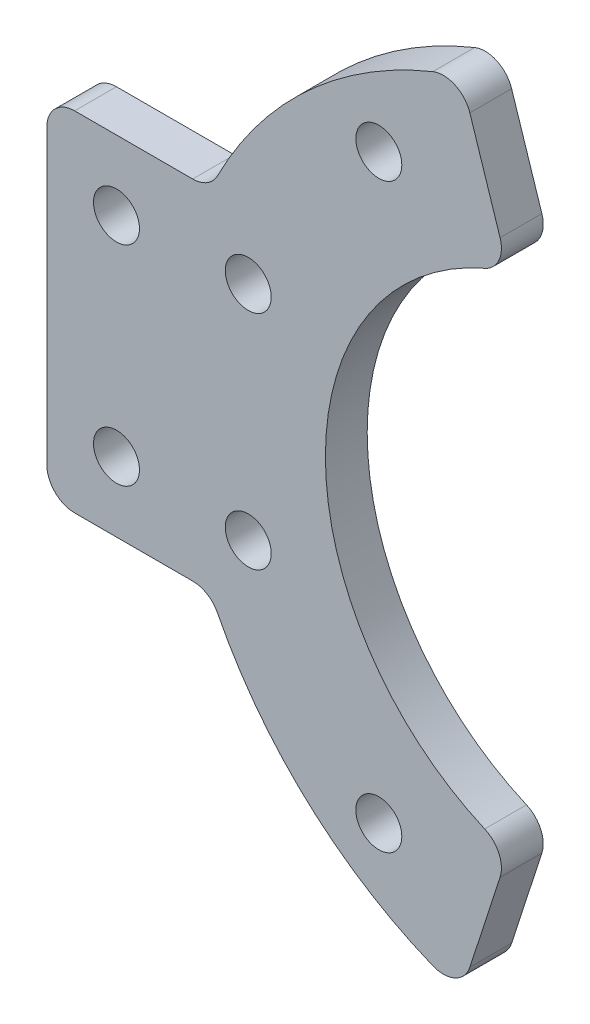
ISO-10303-21;
HEADER;
FILE_DESCRIPTION(('STEP AP214'),'2;1');
FILE_NAME('part.step','',(''),(''),'','','');
FILE_SCHEMA(('AUTOMOTIVE_DESIGN { 1 0 10303 214 1 1 1 1 }'));
ENDSEC;
DATA;
#1=APPLICATION_CONTEXT('core data for automotive mechanical design processes');
#2=APPLICATION_PROTOCOL_DEFINITION('international standard','automotive_design',2000,#1);
#3=PRODUCT_CONTEXT('',#1,'mechanical');
#4=PRODUCT('Part','Part','',(#3));
#5=PRODUCT_RELATED_PRODUCT_CATEGORY('part','',(#4));
#6=PRODUCT_DEFINITION_FORMATION('','',#4);
#7=PRODUCT_DEFINITION_CONTEXT('part definition',#1,'design');
#8=PRODUCT_DEFINITION('design','',#6,#7);
#9=PRODUCT_DEFINITION_SHAPE('','',#8);
#10=(LENGTH_UNIT() NAMED_UNIT(*) SI_UNIT(.MILLI.,.METRE.));
#11=(NAMED_UNIT(*) PLANE_ANGLE_UNIT() SI_UNIT($,.RADIAN.));
#12=(NAMED_UNIT(*) SI_UNIT($,.STERADIAN.) SOLID_ANGLE_UNIT());
#13=UNCERTAINTY_MEASURE_WITH_UNIT(LENGTH_MEASURE(1.E-05),#10,'distance_accuracy_value','');
#14=(GEOMETRIC_REPRESENTATION_CONTEXT(3) GLOBAL_UNCERTAINTY_ASSIGNED_CONTEXT((#13)) GLOBAL_UNIT_ASSIGNED_CONTEXT((#10,
#11,#12)) REPRESENTATION_CONTEXT('',''));
#15=CARTESIAN_POINT('',(0.,0.,0.));
#16=DIRECTION('',(0.,0.,1.));
#17=DIRECTION('',(1.,0.,0.));
#18=AXIS2_PLACEMENT_3D('',#15,#16,#17);
#19=CARTESIAN_POINT('',(-16.7239453700376,38.5267394319841,0.));
#20=DIRECTION('',(0.,0.,-1.));
#21=DIRECTION('',(-1.,0.,0.));
#22=AXIS2_PLACEMENT_3D('',#19,#20,#21);
#23=PLANE('',#22);
#24=CARTESIAN_POINT('',(-49.0745162408299,15.9452769097473,0.));
#25=DIRECTION('',(0.,0.,1.));
#26=DIRECTION('',(1.,0.,0.));
#27=AXIS2_PLACEMENT_3D('',#24,#25,#26);
#28=CIRCLE('',#27,3.3);
#29=CARTESIAN_POINT('',(-45.7745162408299,15.9452769097473,0.));
#30=VERTEX_POINT('',#29);
#31=EDGE_CURVE('E556',#30,#30,#28,.T.);
#32=ORIENTED_EDGE('',*,*,#31,.T.);
#33=EDGE_LOOP('',(#32));
#34=FACE_BOUND('',#33,.T.);
#35=CARTESIAN_POINT('',(-30.3297190182916,-41.7452769097473,0.));
#36=DIRECTION('',(0.,0.,1.));
#37=DIRECTION('',(1.,0.,0.));
#38=AXIS2_PLACEMENT_3D('',#35,#36,#37);
#39=CIRCLE('',#38,3.29999999999999);
#40=CARTESIAN_POINT('',(-27.0297190182916,-41.7452769097473,0.));
#41=VERTEX_POINT('',#40);
#42=EDGE_CURVE('E567',#41,#41,#39,.T.);
#43=ORIENTED_EDGE('',*,*,#42,.T.);
#44=EDGE_LOOP('',(#43));
#45=FACE_BOUND('',#44,.T.);
#46=CARTESIAN_POINT('',(-49.0745162408299,-15.9452769097473,0.));
#47=DIRECTION('',(0.,0.,1.));
#48=DIRECTION('',(1.,0.,0.));
#49=AXIS2_PLACEMENT_3D('',#46,#47,#48);
#50=CIRCLE('',#49,3.3);
#51=CARTESIAN_POINT('',(-45.7745162408299,-15.9452769097473,0.));
#52=VERTEX_POINT('',#51);
#53=EDGE_CURVE('E562',#52,#52,#50,.T.);
#54=ORIENTED_EDGE('',*,*,#53,.T.);
#55=EDGE_LOOP('',(#54));
#56=FACE_BOUND('',#55,.T.);
#57=CARTESIAN_POINT('',(-30.3297190182916,41.7452769097473,0.));
#58=DIRECTION('',(0.,0.,1.));
#59=DIRECTION('',(1.,0.,0.));
#60=AXIS2_PLACEMENT_3D('',#57,#58,#59);
#61=CIRCLE('',#60,3.30000000000001);
#62=CARTESIAN_POINT('',(-27.0297190182916,41.7452769097473,0.));
#63=VERTEX_POINT('',#62);
#64=EDGE_CURVE('E550',#63,#63,#61,.T.);
#65=ORIENTED_EDGE('',*,*,#64,.T.);
#66=EDGE_LOOP('',(#65));
#67=FACE_BOUND('',#66,.T.);
#68=CARTESIAN_POINT('',(0.,0.,0.));
#69=DIRECTION('',(0.,0.,1.));
#70=DIRECTION('',(-1.,0.,0.));
#71=AXIS2_PLACEMENT_3D('',#68,#69,#70);
#72=CIRCLE('',#71,60.);
#73=CARTESIAN_POINT('',(-53.4868193459847,-27.1875,0.));
#74=VERTEX_POINT('',#73);
#75=CARTESIAN_POINT('',(-22.5696171572181,-55.5932764044053,0.));
#76=VERTEX_POINT('',#75);
#77=EDGE_CURVE('E212',#74,#76,#72,.T.);
#78=ORIENTED_EDGE('',*,*,#77,.F.);
#79=CARTESIAN_POINT('',(0.,0.,0.));
#80=DIRECTION('',(0.,0.,-1.));
#81=DIRECTION('',(-1.,0.,0.));
#82=AXIS2_PLACEMENT_3D('',#79,#80,#81);
#83=CIRCLE('',#82,60.);
#84=CARTESIAN_POINT('',(-53.4868193459847,27.1875,0.));
#85=VERTEX_POINT('',#84);
#86=EDGE_CURVE('E11',#74,#85,#83,.T.);
#87=ORIENTED_EDGE('',*,*,#86,.T.);
#88=CARTESIAN_POINT('',(0.,0.,0.));
#89=DIRECTION('',(0.,0.,1.));
#90=DIRECTION('',(-1.,0.,0.));
#91=AXIS2_PLACEMENT_3D('',#88,#89,#90);
#92=CIRCLE('',#91,60.);
#93=CARTESIAN_POINT('',(-22.569617157218,55.5932764044053,0.));
#94=VERTEX_POINT('',#93);
#95=EDGE_CURVE('E194',#94,#85,#92,.T.);
#96=ORIENTED_EDGE('',*,*,#95,.F.);
#97=CARTESIAN_POINT('',(-21.0649760134035,51.887057977445,0.));
#98=DIRECTION('',(0.,0.,1.));
#99=DIRECTION('',(1.,0.,0.));
#100=AXIS2_PLACEMENT_3D('',#97,#98,#99);
#101=CIRCLE('',#100,4.);
#102=CARTESIAN_POINT('',(-17.2607499482229,53.1231259549447,0.));
#103=VERTEX_POINT('',#102);
#104=EDGE_CURVE('E192',#103,#94,#101,.T.);
#105=ORIENTED_EDGE('',*,*,#104,.F.);
#106=DIRECTION('',(-0.309016994374945,0.951056516295154,0.));
#107=VECTOR('',#106,1.);
#108=CARTESIAN_POINT('',(-17.2607499482229,53.1231259549447,0.));
#109=LINE('',#108,#107);
#110=CARTESIAN_POINT('',(-12.9197193048569,39.7628074094839,0.));
#111=VERTEX_POINT('',#110);
#112=EDGE_CURVE('E189',#111,#103,#109,.T.);
#113=ORIENTED_EDGE('',*,*,#112,.F.);
#114=CARTESIAN_POINT('',(-16.7239453700376,38.5267394319841,0.));
#115=DIRECTION('',(0.,0.,1.));
#116=DIRECTION('',(-1.,0.,0.));
#117=AXIS2_PLACEMENT_3D('',#114,#115,#116);
#118=CIRCLE('',#117,4.);
#119=CARTESIAN_POINT('',(-15.1311886681292,34.8575261527475,0.));
#120=VERTEX_POINT('',#119);
#121=EDGE_CURVE('E186',#120,#111,#118,.T.);
#122=ORIENTED_EDGE('',*,*,#121,.F.);
#123=CARTESIAN_POINT('',(0.,0.,0.));
#124=DIRECTION('',(0.,0.,-1.));
#125=DIRECTION('',(-1.,0.,0.));
#126=AXIS2_PLACEMENT_3D('',#123,#124,#125);
#127=CIRCLE('',#126,38.);
#128=CARTESIAN_POINT('',(-15.1311886681292,-34.8575261527475,0.));
#129=VERTEX_POINT('',#128);
#130=EDGE_CURVE('E115',#129,#120,#127,.T.);
#131=ORIENTED_EDGE('',*,*,#130,.F.);
#132=CARTESIAN_POINT('',(-16.7239453700376,-38.5267394319841,0.));
#133=DIRECTION('',(0.,0.,1.));
#134=DIRECTION('',(1.,0.,0.));
#135=AXIS2_PLACEMENT_3D('',#132,#133,#134);
#136=CIRCLE('',#135,4.);
#137=CARTESIAN_POINT('',(-12.9197193048569,-39.7628074094839,0.));
#138=VERTEX_POINT('',#137);
#139=EDGE_CURVE('E109',#138,#129,#136,.T.);
#140=ORIENTED_EDGE('',*,*,#139,.F.);
#141=DIRECTION('',(0.309016994374944,0.951056516295155,0.));
#142=VECTOR('',#141,1.);
#143=CARTESIAN_POINT('',(-12.9197193048569,-39.7628074094839,0.));
#144=LINE('',#143,#142);
#145=CARTESIAN_POINT('',(-17.2607499482229,-53.1231259549447,0.));
#146=VERTEX_POINT('',#145);
#147=EDGE_CURVE('E176',#146,#138,#144,.T.);
#148=ORIENTED_EDGE('',*,*,#147,.F.);
#149=CARTESIAN_POINT('',(-21.0649760134035,-51.887057977445,0.));
#150=DIRECTION('',(0.,0.,1.));
#151=DIRECTION('',(-1.,0.,0.));
#152=AXIS2_PLACEMENT_3D('',#149,#150,#151);
#153=CIRCLE('',#152,4.);
#154=EDGE_CURVE('E214',#76,#146,#153,.T.);
#155=ORIENTED_EDGE('',*,*,#154,.F.);
#156=EDGE_LOOP('',(#78,#87,#96,#105,#113,#122,#131,#140,#148,#155));
#157=FACE_BOUND('',#156,.T.);
#158=ADVANCED_FACE('F39',(#34,#45,#56,#67,#157),#23,.T.);
#159=CARTESIAN_POINT('',(-16.7239453700376,38.5267394319841,6.));
#160=DIRECTION('',(0.,0.,-1.));
#161=DIRECTION('',(-1.,0.,0.));
#162=AXIS2_PLACEMENT_3D('',#159,#160,#161);
#163=PLANE('',#162);
#164=CARTESIAN_POINT('',(-16.7239453700376,38.5267394319841,6.));
#165=DIRECTION('',(0.,0.,1.));
#166=DIRECTION('',(-1.,0.,0.));
#167=AXIS2_PLACEMENT_3D('',#164,#165,#166);
#168=CIRCLE('',#167,4.);
#169=CARTESIAN_POINT('',(-15.1311886681292,34.8575261527475,6.));
#170=VERTEX_POINT('',#169);
#171=CARTESIAN_POINT('',(-12.9197193048569,39.7628074094839,6.));
#172=VERTEX_POINT('',#171);
#173=EDGE_CURVE('E219',#170,#172,#168,.T.);
#174=ORIENTED_EDGE('',*,*,#173,.T.);
#175=DIRECTION('',(-0.309016994374945,0.951056516295154,0.));
#176=VECTOR('',#175,1.);
#177=CARTESIAN_POINT('',(-17.2607499482229,53.1231259549447,6.));
#178=LINE('',#177,#176);
#179=CARTESIAN_POINT('',(-17.2607499482229,53.1231259549447,6.));
#180=VERTEX_POINT('',#179);
#181=EDGE_CURVE('E124',#172,#180,#178,.T.);
#182=ORIENTED_EDGE('',*,*,#181,.T.);
#183=CARTESIAN_POINT('',(-21.0649760134035,51.887057977445,6.));
#184=DIRECTION('',(0.,0.,1.));
#185=DIRECTION('',(1.,0.,0.));
#186=AXIS2_PLACEMENT_3D('',#183,#184,#185);
#187=CIRCLE('',#186,4.);
#188=CARTESIAN_POINT('',(-22.569617157218,55.5932764044053,6.));
#189=VERTEX_POINT('',#188);
#190=EDGE_CURVE('E275',#180,#189,#187,.T.);
#191=ORIENTED_EDGE('',*,*,#190,.T.);
#192=CARTESIAN_POINT('',(0.,0.,6.));
#193=DIRECTION('',(0.,0.,1.));
#194=DIRECTION('',(-1.,0.,0.));
#195=AXIS2_PLACEMENT_3D('',#192,#193,#194);
#196=CIRCLE('',#195,60.);
#197=CARTESIAN_POINT('',(-53.4868193459847,27.1875,6.));
#198=VERTEX_POINT('',#197);
#199=EDGE_CURVE('E272',#189,#198,#196,.T.);
#200=ORIENTED_EDGE('',*,*,#199,.T.);
#201=CARTESIAN_POINT('',(-57.0526073023836,29.,6.));
#202=DIRECTION('',(0.,0.,-1.));
#203=DIRECTION('',(-1.,0.,0.));
#204=AXIS2_PLACEMENT_3D('',#201,#202,#203);
#205=CIRCLE('',#204,4.);
#206=CARTESIAN_POINT('',(-57.0526073023836,25.,6.));
#207=VERTEX_POINT('',#206);
#208=EDGE_CURVE('E274',#198,#207,#205,.T.);
#209=ORIENTED_EDGE('',*,*,#208,.T.);
#210=DIRECTION('',(-1.,0.,0.));
#211=VECTOR('',#210,1.);
#212=CARTESIAN_POINT('',(-57.0526073023836,25.,6.));
#213=LINE('',#212,#211);
#214=CARTESIAN_POINT('',(-74.,25.,6.));
#215=VERTEX_POINT('',#214);
#216=EDGE_CURVE('E277',#207,#215,#213,.T.);
#217=ORIENTED_EDGE('',*,*,#216,.T.);
#218=CARTESIAN_POINT('',(-74.,21.,6.));
#219=DIRECTION('',(0.,0.,1.));
#220=DIRECTION('',(1.,0.,0.));
#221=AXIS2_PLACEMENT_3D('',#218,#219,#220);
#222=CIRCLE('',#221,4.);
#223=CARTESIAN_POINT('',(-78.,21.,6.));
#224=VERTEX_POINT('',#223);
#225=EDGE_CURVE('E283',#215,#224,#222,.T.);
#226=ORIENTED_EDGE('',*,*,#225,.T.);
#227=DIRECTION('',(0.,-1.,0.));
#228=VECTOR('',#227,1.);
#229=CARTESIAN_POINT('',(-78.,21.,6.));
#230=LINE('',#229,#228);
#231=CARTESIAN_POINT('',(-78.,-21.,6.));
#232=VERTEX_POINT('',#231);
#233=EDGE_CURVE('E285',#224,#232,#230,.T.);
#234=ORIENTED_EDGE('',*,*,#233,.T.);
#235=CARTESIAN_POINT('',(-74.,-21.,6.));
#236=DIRECTION('',(0.,0.,1.));
#237=DIRECTION('',(1.,0.,0.));
#238=AXIS2_PLACEMENT_3D('',#235,#236,#237);
#239=CIRCLE('',#238,4.);
#240=CARTESIAN_POINT('',(-74.,-25.,6.));
#241=VERTEX_POINT('',#240);
#242=EDGE_CURVE('E287',#232,#241,#239,.T.);
#243=ORIENTED_EDGE('',*,*,#242,.T.);
#244=DIRECTION('',(1.,0.,0.));
#245=VECTOR('',#244,1.);
#246=CARTESIAN_POINT('',(-74.,-25.,6.));
#247=LINE('',#246,#245);
#248=CARTESIAN_POINT('',(-57.0526073023836,-25.,6.));
#249=VERTEX_POINT('',#248);
#250=EDGE_CURVE('E289',#241,#249,#247,.T.);
#251=ORIENTED_EDGE('',*,*,#250,.T.);
#252=CARTESIAN_POINT('',(-57.0526073023836,-29.,6.));
#253=DIRECTION('',(0.,0.,-1.));
#254=DIRECTION('',(1.,0.,0.));
#255=AXIS2_PLACEMENT_3D('',#252,#253,#254);
#256=CIRCLE('',#255,4.);
#257=CARTESIAN_POINT('',(-53.4868193459847,-27.1875,6.));
#258=VERTEX_POINT('',#257);
#259=EDGE_CURVE('E291',#249,#258,#256,.T.);
#260=ORIENTED_EDGE('',*,*,#259,.T.);
#261=CARTESIAN_POINT('',(0.,0.,6.));
#262=DIRECTION('',(0.,0.,1.));
#263=DIRECTION('',(-1.,0.,0.));
#264=AXIS2_PLACEMENT_3D('',#261,#262,#263);
#265=CIRCLE('',#264,60.);
#266=CARTESIAN_POINT('',(-22.5696171572181,-55.5932764044053,6.));
#267=VERTEX_POINT('',#266);
#268=EDGE_CURVE('E293',#258,#267,#265,.T.);
#269=ORIENTED_EDGE('',*,*,#268,.T.);
#270=CARTESIAN_POINT('',(-21.0649760134035,-51.887057977445,6.));
#271=DIRECTION('',(0.,0.,1.));
#272=DIRECTION('',(-1.,0.,0.));
#273=AXIS2_PLACEMENT_3D('',#270,#271,#272);
#274=CIRCLE('',#273,4.);
#275=CARTESIAN_POINT('',(-17.2607499482229,-53.1231259549447,6.));
#276=VERTEX_POINT('',#275);
#277=EDGE_CURVE('E168',#267,#276,#274,.T.);
#278=ORIENTED_EDGE('',*,*,#277,.T.);
#279=DIRECTION('',(0.309016994374944,0.951056516295155,0.));
#280=VECTOR('',#279,1.);
#281=CARTESIAN_POINT('',(-12.9197193048569,-39.7628074094839,6.));
#282=LINE('',#281,#280);
#283=CARTESIAN_POINT('',(-12.9197193048569,-39.7628074094839,6.));
#284=VERTEX_POINT('',#283);
#285=EDGE_CURVE('E161',#276,#284,#282,.T.);
#286=ORIENTED_EDGE('',*,*,#285,.T.);
#287=CARTESIAN_POINT('',(-16.7239453700376,-38.5267394319841,6.));
#288=DIRECTION('',(0.,0.,1.));
#289=DIRECTION('',(1.,0.,0.));
#290=AXIS2_PLACEMENT_3D('',#287,#288,#289);
#291=CIRCLE('',#290,4.);
#292=CARTESIAN_POINT('',(-15.1311886681292,-34.8575261527475,6.));
#293=VERTEX_POINT('',#292);
#294=EDGE_CURVE('E166',#284,#293,#291,.T.);
#295=ORIENTED_EDGE('',*,*,#294,.T.);
#296=CARTESIAN_POINT('',(0.,0.,6.));
#297=DIRECTION('',(0.,0.,-1.));
#298=DIRECTION('',(-1.,0.,0.));
#299=AXIS2_PLACEMENT_3D('',#296,#297,#298);
#300=CIRCLE('',#299,38.);
#301=EDGE_CURVE('E57',#293,#170,#300,.T.);
#302=ORIENTED_EDGE('',*,*,#301,.T.);
#303=EDGE_LOOP('',(#174,#182,#191,#200,#209,#217,#226,#234,#243,#251,#260,#269,#278,#286,#295,#302));
#304=FACE_BOUND('',#303,.T.);
#305=CARTESIAN_POINT('',(-68.,15.,6.));
#306=DIRECTION('',(0.,0.,1.));
#307=DIRECTION('',(1.,0.,0.));
#308=AXIS2_PLACEMENT_3D('',#305,#306,#307);
#309=CIRCLE('',#308,3.30000000000001);
#310=CARTESIAN_POINT('',(-64.7,15.,6.));
#311=VERTEX_POINT('',#310);
#312=EDGE_CURVE('E190',#311,#311,#309,.T.);
#313=ORIENTED_EDGE('',*,*,#312,.F.);
#314=EDGE_LOOP('',(#313));
#315=FACE_BOUND('',#314,.T.);
#316=CARTESIAN_POINT('',(-30.3297190182916,-41.7452769097473,6.));
#317=DIRECTION('',(0.,0.,1.));
#318=DIRECTION('',(1.,0.,0.));
#319=AXIS2_PLACEMENT_3D('',#316,#317,#318);
#320=CIRCLE('',#319,3.29999999999999);
#321=CARTESIAN_POINT('',(-27.0297190182916,-41.7452769097473,6.));
#322=VERTEX_POINT('',#321);
#323=EDGE_CURVE('E570',#322,#322,#320,.T.);
#324=ORIENTED_EDGE('',*,*,#323,.F.);
#325=EDGE_LOOP('',(#324));
#326=FACE_BOUND('',#325,.T.);
#327=CARTESIAN_POINT('',(-49.0745162408299,-15.9452769097473,6.));
#328=DIRECTION('',(0.,0.,1.));
#329=DIRECTION('',(1.,0.,0.));
#330=AXIS2_PLACEMENT_3D('',#327,#328,#329);
#331=CIRCLE('',#330,3.3);
#332=CARTESIAN_POINT('',(-45.7745162408299,-15.9452769097473,6.));
#333=VERTEX_POINT('',#332);
#334=EDGE_CURVE('E564',#333,#333,#331,.T.);
#335=ORIENTED_EDGE('',*,*,#334,.F.);
#336=EDGE_LOOP('',(#335));
#337=FACE_BOUND('',#336,.T.);
#338=CARTESIAN_POINT('',(-49.0745162408299,15.9452769097473,6.));
#339=DIRECTION('',(0.,0.,1.));
#340=DIRECTION('',(1.,0.,0.));
#341=AXIS2_PLACEMENT_3D('',#338,#339,#340);
#342=CIRCLE('',#341,3.3);
#343=CARTESIAN_POINT('',(-45.7745162408299,15.9452769097473,6.));
#344=VERTEX_POINT('',#343);
#345=EDGE_CURVE('E559',#344,#344,#342,.T.);
#346=ORIENTED_EDGE('',*,*,#345,.F.);
#347=EDGE_LOOP('',(#346));
#348=FACE_BOUND('',#347,.T.);
#349=CARTESIAN_POINT('',(-30.3297190182916,41.7452769097473,6.));
#350=DIRECTION('',(0.,0.,1.));
#351=DIRECTION('',(1.,0.,0.));
#352=AXIS2_PLACEMENT_3D('',#349,#350,#351);
#353=CIRCLE('',#352,3.30000000000001);
#354=CARTESIAN_POINT('',(-27.0297190182916,41.7452769097473,6.));
#355=VERTEX_POINT('',#354);
#356=EDGE_CURVE('E553',#355,#355,#353,.T.);
#357=ORIENTED_EDGE('',*,*,#356,.F.);
#358=EDGE_LOOP('',(#357));
#359=FACE_BOUND('',#358,.T.);
#360=CARTESIAN_POINT('',(-68.,-15.,6.));
#361=DIRECTION('',(0.,0.,1.));
#362=DIRECTION('',(1.,0.,0.));
#363=AXIS2_PLACEMENT_3D('',#360,#361,#362);
#364=CIRCLE('',#363,3.29999999999999);
#365=CARTESIAN_POINT('',(-64.7,-15.,6.));
#366=VERTEX_POINT('',#365);
#367=EDGE_CURVE('E544',#366,#366,#364,.T.);
#368=ORIENTED_EDGE('',*,*,#367,.F.);
#369=EDGE_LOOP('',(#368));
#370=FACE_BOUND('',#369,.T.);
#371=ADVANCED_FACE('F163',(#304,#315,#326,#337,#348,#359,#370),#163,.F.);
#372=ORIENTED_EDGE('',*,*,#86,.F.);
#373=CARTESIAN_POINT('',(-57.0526073023836,-29.,0.));
#374=DIRECTION('',(0.,0.,-1.));
#375=DIRECTION('',(1.,0.,0.));
#376=AXIS2_PLACEMENT_3D('',#373,#374,#375);
#377=CIRCLE('',#376,4.);
#378=CARTESIAN_POINT('',(-57.0526073023836,-25.,0.));
#379=VERTEX_POINT('',#378);
#380=EDGE_CURVE('E209',#379,#74,#377,.T.);
#381=ORIENTED_EDGE('',*,*,#380,.F.);
#382=DIRECTION('',(1.,0.,0.));
#383=VECTOR('',#382,1.);
#384=CARTESIAN_POINT('',(-74.,-25.,0.));
#385=LINE('',#384,#383);
#386=CARTESIAN_POINT('',(-74.,-25.,0.));
#387=VERTEX_POINT('',#386);
#388=EDGE_CURVE('E207',#387,#379,#385,.T.);
#389=ORIENTED_EDGE('',*,*,#388,.F.);
#390=CARTESIAN_POINT('',(-74.,-21.,0.));
#391=DIRECTION('',(0.,0.,1.));
#392=DIRECTION('',(1.,0.,0.));
#393=AXIS2_PLACEMENT_3D('',#390,#391,#392);
#394=CIRCLE('',#393,4.);
#395=CARTESIAN_POINT('',(-78.,-21.,0.));
#396=VERTEX_POINT('',#395);
#397=EDGE_CURVE('E205',#396,#387,#394,.T.);
#398=ORIENTED_EDGE('',*,*,#397,.F.);
#399=DIRECTION('',(0.,-1.,0.));
#400=VECTOR('',#399,1.);
#401=CARTESIAN_POINT('',(-78.,21.,0.));
#402=LINE('',#401,#400);
#403=CARTESIAN_POINT('',(-78.,21.,0.));
#404=VERTEX_POINT('',#403);
#405=EDGE_CURVE('E203',#404,#396,#402,.T.);
#406=ORIENTED_EDGE('',*,*,#405,.F.);
#407=CARTESIAN_POINT('',(-74.,21.,0.));
#408=DIRECTION('',(0.,0.,1.));
#409=DIRECTION('',(1.,0.,0.));
#410=AXIS2_PLACEMENT_3D('',#407,#408,#409);
#411=CIRCLE('',#410,4.);
#412=CARTESIAN_POINT('',(-74.,25.,0.));
#413=VERTEX_POINT('',#412);
#414=EDGE_CURVE('E201',#413,#404,#411,.T.);
#415=ORIENTED_EDGE('',*,*,#414,.F.);
#416=DIRECTION('',(-1.,0.,0.));
#417=VECTOR('',#416,1.);
#418=CARTESIAN_POINT('',(-57.0526073023836,25.,0.));
#419=LINE('',#418,#417);
#420=CARTESIAN_POINT('',(-57.0526073023836,25.,0.));
#421=VERTEX_POINT('',#420);
#422=EDGE_CURVE('E199',#421,#413,#419,.T.);
#423=ORIENTED_EDGE('',*,*,#422,.F.);
#424=CARTESIAN_POINT('',(-57.0526073023836,29.,0.));
#425=DIRECTION('',(0.,0.,-1.));
#426=DIRECTION('',(-1.,0.,0.));
#427=AXIS2_PLACEMENT_3D('',#424,#425,#426);
#428=CIRCLE('',#427,4.);
#429=EDGE_CURVE('E197',#85,#421,#428,.T.);
#430=ORIENTED_EDGE('',*,*,#429,.F.);
#431=EDGE_LOOP('',(#372,#381,#389,#398,#406,#415,#423,#430));
#432=FACE_BOUND('',#431,.T.);
#433=CARTESIAN_POINT('',(-68.,15.,0.));
#434=DIRECTION('',(0.,0.,1.));
#435=DIRECTION('',(1.,0.,0.));
#436=AXIS2_PLACEMENT_3D('',#433,#434,#435);
#437=CIRCLE('',#436,3.30000000000001);
#438=CARTESIAN_POINT('',(-64.7,15.,0.));
#439=VERTEX_POINT('',#438);
#440=EDGE_CURVE('E573',#439,#439,#437,.T.);
#441=ORIENTED_EDGE('',*,*,#440,.T.);
#442=EDGE_LOOP('',(#441));
#443=FACE_BOUND('',#442,.T.);
#444=CARTESIAN_POINT('',(-68.,-15.,0.));
#445=DIRECTION('',(0.,0.,1.));
#446=DIRECTION('',(1.,0.,0.));
#447=AXIS2_PLACEMENT_3D('',#444,#445,#446);
#448=CIRCLE('',#447,3.29999999999999);
#449=CARTESIAN_POINT('',(-64.7,-15.,0.));
#450=VERTEX_POINT('',#449);
#451=EDGE_CURVE('E547',#450,#450,#448,.T.);
#452=ORIENTED_EDGE('',*,*,#451,.T.);
#453=EDGE_LOOP('',(#452));
#454=FACE_BOUND('',#453,.T.);
#455=ADVANCED_FACE('F306',(#432,#443,#454),#23,.T.);
#456=CARTESIAN_POINT('',(-16.7239453700376,38.5267394319841,6.));
#457=DIRECTION('',(0.,0.,-1.));
#458=DIRECTION('',(-1.,0.,0.));
#459=AXIS2_PLACEMENT_3D('',#456,#457,#458);
#460=CYLINDRICAL_SURFACE('',#459,4.);
#461=ORIENTED_EDGE('',*,*,#121,.T.);
#462=DIRECTION('',(0.,0.,-1.));
#463=VECTOR('',#462,1.);
#464=CARTESIAN_POINT('',(-12.9197193048569,39.7628074094839,6.));
#465=LINE('',#464,#463);
#466=EDGE_CURVE('E49',#172,#111,#465,.T.);
#467=ORIENTED_EDGE('',*,*,#466,.F.);
#468=ORIENTED_EDGE('',*,*,#173,.F.);
#469=DIRECTION('',(0.,0.,-1.));
#470=VECTOR('',#469,1.);
#471=CARTESIAN_POINT('',(-15.1311886681292,34.8575261527475,6.));
#472=LINE('',#471,#470);
#473=EDGE_CURVE('E182',#170,#120,#472,.T.);
#474=ORIENTED_EDGE('',*,*,#473,.T.);
#475=EDGE_LOOP('',(#461,#467,#468,#474));
#476=FACE_BOUND('',#475,.T.);
#477=ADVANCED_FACE('F41',(#476),#460,.T.);
#478=CARTESIAN_POINT('',(-17.2607499482229,53.1231259549447,6.));
#479=DIRECTION('',(-0.951056516295154,-0.309016994374945,0.));
#480=DIRECTION('',(0.309016994374945,-0.951056516295154,0.));
#481=AXIS2_PLACEMENT_3D('',#478,#479,#480);
#482=PLANE('',#481);
#483=ORIENTED_EDGE('',*,*,#112,.T.);
#484=DIRECTION('',(0.,0.,-1.));
#485=VECTOR('',#484,1.);
#486=CARTESIAN_POINT('',(-17.2607499482229,53.1231259549447,6.));
#487=LINE('',#486,#485);
#488=EDGE_CURVE('E253',#180,#103,#487,.T.);
#489=ORIENTED_EDGE('',*,*,#488,.F.);
#490=ORIENTED_EDGE('',*,*,#181,.F.);
#491=ORIENTED_EDGE('',*,*,#466,.T.);
#492=EDGE_LOOP('',(#483,#489,#490,#491));
#493=FACE_BOUND('',#492,.T.);
#494=ADVANCED_FACE('F256',(#493),#482,.F.);
#495=CARTESIAN_POINT('',(-21.0649760134035,51.887057977445,6.));
#496=DIRECTION('',(0.,0.,-1.));
#497=DIRECTION('',(-1.,0.,0.));
#498=AXIS2_PLACEMENT_3D('',#495,#496,#497);
#499=CYLINDRICAL_SURFACE('',#498,4.);
#500=ORIENTED_EDGE('',*,*,#104,.T.);
#501=DIRECTION('',(0.,0.,-1.));
#502=VECTOR('',#501,1.);
#503=CARTESIAN_POINT('',(-22.569617157218,55.5932764044053,6.));
#504=LINE('',#503,#502);
#505=EDGE_CURVE('E250',#189,#94,#504,.T.);
#506=ORIENTED_EDGE('',*,*,#505,.F.);
#507=ORIENTED_EDGE('',*,*,#190,.F.);
#508=ORIENTED_EDGE('',*,*,#488,.T.);
#509=EDGE_LOOP('',(#500,#506,#507,#508));
#510=FACE_BOUND('',#509,.T.);
#511=ADVANCED_FACE('F266',(#510),#499,.T.);
#512=CARTESIAN_POINT('',(0.,0.,6.));
#513=DIRECTION('',(0.,0.,-1.));
#514=DIRECTION('',(-1.,0.,0.));
#515=AXIS2_PLACEMENT_3D('',#512,#513,#514);
#516=CYLINDRICAL_SURFACE('',#515,60.);
#517=ORIENTED_EDGE('',*,*,#95,.T.);
#518=DIRECTION('',(0.,0.,-1.));
#519=VECTOR('',#518,1.);
#520=CARTESIAN_POINT('',(-53.4868193459847,27.1875,6.));
#521=LINE('',#520,#519);
#522=EDGE_CURVE('E247',#198,#85,#521,.T.);
#523=ORIENTED_EDGE('',*,*,#522,.F.);
#524=ORIENTED_EDGE('',*,*,#199,.F.);
#525=ORIENTED_EDGE('',*,*,#505,.T.);
#526=EDGE_LOOP('',(#517,#523,#524,#525));
#527=FACE_BOUND('',#526,.T.);
#528=ADVANCED_FACE('F270',(#527),#516,.T.);
#529=CARTESIAN_POINT('',(-57.0526073023836,29.,6.));
#530=DIRECTION('',(0.,0.,-1.));
#531=DIRECTION('',(-1.,0.,0.));
#532=AXIS2_PLACEMENT_3D('',#529,#530,#531);
#533=CYLINDRICAL_SURFACE('',#532,4.);
#534=ORIENTED_EDGE('',*,*,#429,.T.);
#535=DIRECTION('',(0.,0.,-1.));
#536=VECTOR('',#535,1.);
#537=CARTESIAN_POINT('',(-57.0526073023836,25.,6.));
#538=LINE('',#537,#536);
#539=EDGE_CURVE('E244',#207,#421,#538,.T.);
#540=ORIENTED_EDGE('',*,*,#539,.F.);
#541=ORIENTED_EDGE('',*,*,#208,.F.);
#542=ORIENTED_EDGE('',*,*,#522,.T.);
#543=EDGE_LOOP('',(#534,#540,#541,#542));
#544=FACE_BOUND('',#543,.T.);
#545=ADVANCED_FACE('F337',(#544),#533,.F.);
#546=CARTESIAN_POINT('',(-57.0526073023836,25.,6.));
#547=DIRECTION('',(0.,-1.,0.));
#548=DIRECTION('',(1.,0.,0.));
#549=AXIS2_PLACEMENT_3D('',#546,#547,#548);
#550=PLANE('',#549);
#551=ORIENTED_EDGE('',*,*,#422,.T.);
#552=DIRECTION('',(0.,0.,-1.));
#553=VECTOR('',#552,1.);
#554=CARTESIAN_POINT('',(-74.,25.,6.));
#555=LINE('',#554,#553);
#556=EDGE_CURVE('E241',#215,#413,#555,.T.);
#557=ORIENTED_EDGE('',*,*,#556,.F.);
#558=ORIENTED_EDGE('',*,*,#216,.F.);
#559=ORIENTED_EDGE('',*,*,#539,.T.);
#560=EDGE_LOOP('',(#551,#557,#558,#559));
#561=FACE_BOUND('',#560,.T.);
#562=ADVANCED_FACE('F333',(#561),#550,.F.);
#563=CARTESIAN_POINT('',(-74.,21.,6.));
#564=DIRECTION('',(0.,0.,-1.));
#565=DIRECTION('',(-1.,0.,0.));
#566=AXIS2_PLACEMENT_3D('',#563,#564,#565);
#567=CYLINDRICAL_SURFACE('',#566,4.);
#568=ORIENTED_EDGE('',*,*,#414,.T.);
#569=DIRECTION('',(0.,0.,-1.));
#570=VECTOR('',#569,1.);
#571=CARTESIAN_POINT('',(-78.,21.,6.));
#572=LINE('',#571,#570);
#573=EDGE_CURVE('E238',#224,#404,#572,.T.);
#574=ORIENTED_EDGE('',*,*,#573,.F.);
#575=ORIENTED_EDGE('',*,*,#225,.F.);
#576=ORIENTED_EDGE('',*,*,#556,.T.);
#577=EDGE_LOOP('',(#568,#574,#575,#576));
#578=FACE_BOUND('',#577,.T.);
#579=ADVANCED_FACE('F330',(#578),#567,.T.);
#580=CARTESIAN_POINT('',(-78.,21.,6.));
#581=DIRECTION('',(1.,0.,0.));
#582=DIRECTION('',(0.,0.,-1.));
#583=AXIS2_PLACEMENT_3D('',#580,#581,#582);
#584=PLANE('',#583);
#585=ORIENTED_EDGE('',*,*,#405,.T.);
#586=DIRECTION('',(0.,0.,-1.));
#587=VECTOR('',#586,1.);
#588=CARTESIAN_POINT('',(-78.,-21.,6.));
#589=LINE('',#588,#587);
#590=EDGE_CURVE('E235',#232,#396,#589,.T.);
#591=ORIENTED_EDGE('',*,*,#590,.F.);
#592=ORIENTED_EDGE('',*,*,#233,.F.);
#593=ORIENTED_EDGE('',*,*,#573,.T.);
#594=EDGE_LOOP('',(#585,#591,#592,#593));
#595=FACE_BOUND('',#594,.T.);
#596=ADVANCED_FACE('F326',(#595),#584,.F.);
#597=CARTESIAN_POINT('',(-74.,-21.,6.));
#598=DIRECTION('',(0.,0.,-1.));
#599=DIRECTION('',(-1.,0.,0.));
#600=AXIS2_PLACEMENT_3D('',#597,#598,#599);
#601=CYLINDRICAL_SURFACE('',#600,4.);
#602=ORIENTED_EDGE('',*,*,#397,.T.);
#603=DIRECTION('',(0.,0.,-1.));
#604=VECTOR('',#603,1.);
#605=CARTESIAN_POINT('',(-74.,-25.,6.));
#606=LINE('',#605,#604);
#607=EDGE_CURVE('E232',#241,#387,#606,.T.);
#608=ORIENTED_EDGE('',*,*,#607,.F.);
#609=ORIENTED_EDGE('',*,*,#242,.F.);
#610=ORIENTED_EDGE('',*,*,#590,.T.);
#611=EDGE_LOOP('',(#602,#608,#609,#610));
#612=FACE_BOUND('',#611,.T.);
#613=ADVANCED_FACE('F321',(#612),#601,.T.);
#614=CARTESIAN_POINT('',(-74.,-25.,6.));
#615=DIRECTION('',(0.,1.,0.));
#616=DIRECTION('',(-1.,0.,0.));
#617=AXIS2_PLACEMENT_3D('',#614,#615,#616);
#618=PLANE('',#617);
#619=ORIENTED_EDGE('',*,*,#388,.T.);
#620=DIRECTION('',(0.,0.,-1.));
#621=VECTOR('',#620,1.);
#622=CARTESIAN_POINT('',(-57.0526073023836,-25.,6.));
#623=LINE('',#622,#621);
#624=EDGE_CURVE('E229',#249,#379,#623,.T.);
#625=ORIENTED_EDGE('',*,*,#624,.F.);
#626=ORIENTED_EDGE('',*,*,#250,.F.);
#627=ORIENTED_EDGE('',*,*,#607,.T.);
#628=EDGE_LOOP('',(#619,#625,#626,#627));
#629=FACE_BOUND('',#628,.T.);
#630=ADVANCED_FACE('F315',(#629),#618,.F.);
#631=CARTESIAN_POINT('',(-57.0526073023836,-29.,6.));
#632=DIRECTION('',(0.,0.,-1.));
#633=DIRECTION('',(-1.,0.,0.));
#634=AXIS2_PLACEMENT_3D('',#631,#632,#633);
#635=CYLINDRICAL_SURFACE('',#634,4.);
#636=ORIENTED_EDGE('',*,*,#380,.T.);
#637=DIRECTION('',(0.,0.,-1.));
#638=VECTOR('',#637,1.);
#639=CARTESIAN_POINT('',(-53.4868193459847,-27.1875,6.));
#640=LINE('',#639,#638);
#641=EDGE_CURVE('E226',#258,#74,#640,.T.);
#642=ORIENTED_EDGE('',*,*,#641,.F.);
#643=ORIENTED_EDGE('',*,*,#259,.F.);
#644=ORIENTED_EDGE('',*,*,#624,.T.);
#645=EDGE_LOOP('',(#636,#642,#643,#644));
#646=FACE_BOUND('',#645,.T.);
#647=ADVANCED_FACE('F311',(#646),#635,.F.);
#648=CARTESIAN_POINT('',(0.,0.,6.));
#649=DIRECTION('',(0.,0.,-1.));
#650=DIRECTION('',(-1.,0.,0.));
#651=AXIS2_PLACEMENT_3D('',#648,#649,#650);
#652=CYLINDRICAL_SURFACE('',#651,60.);
#653=ORIENTED_EDGE('',*,*,#77,.T.);
#654=DIRECTION('',(0.,0.,-1.));
#655=VECTOR('',#654,1.);
#656=CARTESIAN_POINT('',(-22.5696171572181,-55.5932764044053,6.));
#657=LINE('',#656,#655);
#658=EDGE_CURVE('E223',#267,#76,#657,.T.);
#659=ORIENTED_EDGE('',*,*,#658,.F.);
#660=ORIENTED_EDGE('',*,*,#268,.F.);
#661=ORIENTED_EDGE('',*,*,#641,.T.);
#662=EDGE_LOOP('',(#653,#659,#660,#661));
#663=FACE_BOUND('',#662,.T.);
#664=ADVANCED_FACE('F299',(#663),#652,.T.);
#665=CARTESIAN_POINT('',(-21.0649760134035,-51.887057977445,6.));
#666=DIRECTION('',(0.,0.,-1.));
#667=DIRECTION('',(-1.,0.,0.));
#668=AXIS2_PLACEMENT_3D('',#665,#666,#667);
#669=CYLINDRICAL_SURFACE('',#668,4.);
#670=ORIENTED_EDGE('',*,*,#154,.T.);
#671=DIRECTION('',(0.,0.,-1.));
#672=VECTOR('',#671,1.);
#673=CARTESIAN_POINT('',(-17.2607499482229,-53.1231259549447,6.));
#674=LINE('',#673,#672);
#675=EDGE_CURVE('E177',#276,#146,#674,.T.);
#676=ORIENTED_EDGE('',*,*,#675,.F.);
#677=ORIENTED_EDGE('',*,*,#277,.F.);
#678=ORIENTED_EDGE('',*,*,#658,.T.);
#679=EDGE_LOOP('',(#670,#676,#677,#678));
#680=FACE_BOUND('',#679,.T.);
#681=ADVANCED_FACE('F302',(#680),#669,.T.);
#682=CARTESIAN_POINT('',(-12.9197193048569,-39.7628074094839,6.));
#683=DIRECTION('',(-0.951056516295155,0.309016994374944,0.));
#684=DIRECTION('',(-0.309016994374944,-0.951056516295155,0.));
#685=AXIS2_PLACEMENT_3D('',#682,#683,#684);
#686=PLANE('',#685);
#687=ORIENTED_EDGE('',*,*,#147,.T.);
#688=DIRECTION('',(0.,0.,-1.));
#689=VECTOR('',#688,1.);
#690=CARTESIAN_POINT('',(-12.9197193048569,-39.7628074094839,6.));
#691=LINE('',#690,#689);
#692=EDGE_CURVE('E173',#284,#138,#691,.T.);
#693=ORIENTED_EDGE('',*,*,#692,.F.);
#694=ORIENTED_EDGE('',*,*,#285,.F.);
#695=ORIENTED_EDGE('',*,*,#675,.T.);
#696=EDGE_LOOP('',(#687,#693,#694,#695));
#697=FACE_BOUND('',#696,.T.);
#698=ADVANCED_FACE('F174',(#697),#686,.F.);
#699=CARTESIAN_POINT('',(-16.7239453700376,-38.5267394319841,6.));
#700=DIRECTION('',(0.,0.,-1.));
#701=DIRECTION('',(-1.,0.,0.));
#702=AXIS2_PLACEMENT_3D('',#699,#700,#701);
#703=CYLINDRICAL_SURFACE('',#702,4.);
#704=ORIENTED_EDGE('',*,*,#139,.T.);
#705=DIRECTION('',(0.,0.,-1.));
#706=VECTOR('',#705,1.);
#707=CARTESIAN_POINT('',(-15.1311886681292,-34.8575261527475,6.));
#708=LINE('',#707,#706);
#709=EDGE_CURVE('E178',#293,#129,#708,.T.);
#710=ORIENTED_EDGE('',*,*,#709,.F.);
#711=ORIENTED_EDGE('',*,*,#294,.F.);
#712=ORIENTED_EDGE('',*,*,#692,.T.);
#713=EDGE_LOOP('',(#704,#710,#711,#712));
#714=FACE_BOUND('',#713,.T.);
#715=ADVANCED_FACE('F180',(#714),#703,.T.);
#716=CARTESIAN_POINT('',(0.,0.,6.));
#717=DIRECTION('',(0.,0.,-1.));
#718=DIRECTION('',(-1.,0.,0.));
#719=AXIS2_PLACEMENT_3D('',#716,#717,#718);
#720=CYLINDRICAL_SURFACE('',#719,38.);
#721=ORIENTED_EDGE('',*,*,#130,.T.);
#722=ORIENTED_EDGE('',*,*,#473,.F.);
#723=ORIENTED_EDGE('',*,*,#301,.F.);
#724=ORIENTED_EDGE('',*,*,#709,.T.);
#725=EDGE_LOOP('',(#721,#722,#723,#724));
#726=FACE_BOUND('',#725,.T.);
#727=ADVANCED_FACE('F456',(#726),#720,.F.);
#728=CARTESIAN_POINT('',(-68.,15.,6.));
#729=DIRECTION('',(0.,0.,-1.));
#730=DIRECTION('',(-1.,0.,0.));
#731=AXIS2_PLACEMENT_3D('',#728,#729,#730);
#732=CYLINDRICAL_SURFACE('',#731,3.30000000000001);
#733=ORIENTED_EDGE('',*,*,#312,.T.);
#734=EDGE_LOOP('',(#733));
#735=FACE_BOUND('',#734,.T.);
#736=ORIENTED_EDGE('',*,*,#440,.F.);
#737=EDGE_LOOP('',(#736));
#738=FACE_BOUND('',#737,.T.);
#739=ADVANCED_FACE('F465',(#735,#738),#732,.F.);
#740=CARTESIAN_POINT('',(-30.3297190182916,-41.7452769097473,6.));
#741=DIRECTION('',(0.,0.,-1.));
#742=DIRECTION('',(-1.,0.,0.));
#743=AXIS2_PLACEMENT_3D('',#740,#741,#742);
#744=CYLINDRICAL_SURFACE('',#743,3.29999999999999);
#745=ORIENTED_EDGE('',*,*,#323,.T.);
#746=EDGE_LOOP('',(#745));
#747=FACE_BOUND('',#746,.T.);
#748=ORIENTED_EDGE('',*,*,#42,.F.);
#749=EDGE_LOOP('',(#748));
#750=FACE_BOUND('',#749,.T.);
#751=ADVANCED_FACE('F473',(#747,#750),#744,.F.);
#752=CARTESIAN_POINT('',(-49.0745162408299,-15.9452769097473,6.));
#753=DIRECTION('',(0.,0.,-1.));
#754=DIRECTION('',(-1.,0.,0.));
#755=AXIS2_PLACEMENT_3D('',#752,#753,#754);
#756=CYLINDRICAL_SURFACE('',#755,3.3);
#757=ORIENTED_EDGE('',*,*,#334,.T.);
#758=EDGE_LOOP('',(#757));
#759=FACE_BOUND('',#758,.T.);
#760=ORIENTED_EDGE('',*,*,#53,.F.);
#761=EDGE_LOOP('',(#760));
#762=FACE_BOUND('',#761,.T.);
#763=ADVANCED_FACE('F483',(#759,#762),#756,.F.);
#764=CARTESIAN_POINT('',(-49.0745162408299,15.9452769097473,6.));
#765=DIRECTION('',(0.,0.,-1.));
#766=DIRECTION('',(-1.,0.,0.));
#767=AXIS2_PLACEMENT_3D('',#764,#765,#766);
#768=CYLINDRICAL_SURFACE('',#767,3.3);
#769=ORIENTED_EDGE('',*,*,#345,.T.);
#770=EDGE_LOOP('',(#769));
#771=FACE_BOUND('',#770,.T.);
#772=ORIENTED_EDGE('',*,*,#31,.F.);
#773=EDGE_LOOP('',(#772));
#774=FACE_BOUND('',#773,.T.);
#775=ADVANCED_FACE('F493',(#771,#774),#768,.F.);
#776=CARTESIAN_POINT('',(-30.3297190182916,41.7452769097473,6.));
#777=DIRECTION('',(0.,0.,-1.));
#778=DIRECTION('',(-1.,0.,0.));
#779=AXIS2_PLACEMENT_3D('',#776,#777,#778);
#780=CYLINDRICAL_SURFACE('',#779,3.30000000000001);
#781=ORIENTED_EDGE('',*,*,#356,.T.);
#782=EDGE_LOOP('',(#781));
#783=FACE_BOUND('',#782,.T.);
#784=ORIENTED_EDGE('',*,*,#64,.F.);
#785=EDGE_LOOP('',(#784));
#786=FACE_BOUND('',#785,.T.);
#787=ADVANCED_FACE('F503',(#783,#786),#780,.F.);
#788=CARTESIAN_POINT('',(-68.,-15.,6.));
#789=DIRECTION('',(0.,0.,-1.));
#790=DIRECTION('',(-1.,0.,0.));
#791=AXIS2_PLACEMENT_3D('',#788,#789,#790);
#792=CYLINDRICAL_SURFACE('',#791,3.29999999999999);
#793=ORIENTED_EDGE('',*,*,#367,.T.);
#794=EDGE_LOOP('',(#793));
#795=FACE_BOUND('',#794,.T.);
#796=ORIENTED_EDGE('',*,*,#451,.F.);
#797=EDGE_LOOP('',(#796));
#798=FACE_BOUND('',#797,.T.);
#799=ADVANCED_FACE('F513',(#795,#798),#792,.F.);
#800=CLOSED_SHELL('',(#158,#371,#455,#477,#494,#511,#528,#545,#562,#579,#596,#613,#630,#647,
#664,#681,#698,#715,#727,#739,#751,#763,#775,#787,#799));
#801=MANIFOLD_SOLID_BREP('B2',#800);
#802=ADVANCED_BREP_SHAPE_REPRESENTATION('',(#18,#801),#14);
#803=SHAPE_DEFINITION_REPRESENTATION(#9,#802);
ENDSEC;
END-ISO-10303-21;
